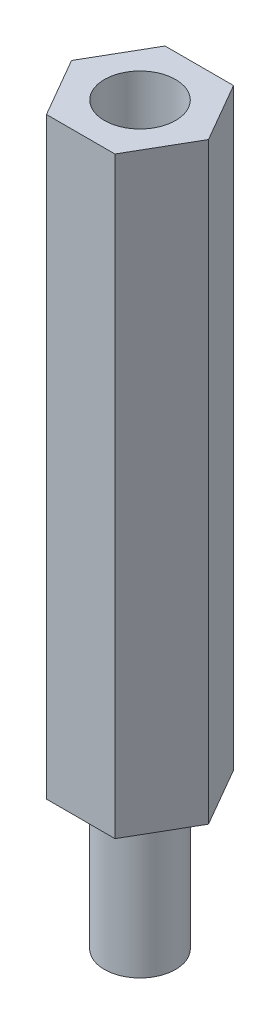
ISO-10303-21;
HEADER;
FILE_DESCRIPTION(('STEP AP214'),'2;1');
FILE_NAME('part.step','',(''),(''),'','','');
FILE_SCHEMA(('AUTOMOTIVE_DESIGN { 1 0 10303 214 1 1 1 1 }'));
ENDSEC;
DATA;
#1=APPLICATION_CONTEXT('core data for automotive mechanical design processes');
#2=APPLICATION_PROTOCOL_DEFINITION('international standard','automotive_design',2000,#1);
#3=PRODUCT_CONTEXT('',#1,'mechanical');
#4=PRODUCT('Part','Part','',(#3));
#5=PRODUCT_RELATED_PRODUCT_CATEGORY('part','',(#4));
#6=PRODUCT_DEFINITION_FORMATION('','',#4);
#7=PRODUCT_DEFINITION_CONTEXT('part definition',#1,'design');
#8=PRODUCT_DEFINITION('design','',#6,#7);
#9=PRODUCT_DEFINITION_SHAPE('','',#8);
#10=(LENGTH_UNIT() NAMED_UNIT(*) SI_UNIT(.MILLI.,.METRE.));
#11=(NAMED_UNIT(*) PLANE_ANGLE_UNIT() SI_UNIT($,.RADIAN.));
#12=(NAMED_UNIT(*) SI_UNIT($,.STERADIAN.) SOLID_ANGLE_UNIT());
#13=UNCERTAINTY_MEASURE_WITH_UNIT(LENGTH_MEASURE(1.E-05),#10,'distance_accuracy_value','');
#14=(GEOMETRIC_REPRESENTATION_CONTEXT(3) GLOBAL_UNCERTAINTY_ASSIGNED_CONTEXT((#13)) GLOBAL_UNIT_ASSIGNED_CONTEXT((#10,
#11,#12)) REPRESENTATION_CONTEXT('',''));
#15=CARTESIAN_POINT('',(0.,0.,0.));
#16=DIRECTION('',(0.,0.,1.));
#17=DIRECTION('',(1.,0.,0.));
#18=AXIS2_PLACEMENT_3D('',#15,#16,#17);
#19=CARTESIAN_POINT('',(0.,19.,0.));
#20=DIRECTION('',(0.,1.,0.));
#21=DIRECTION('',(0.,0.,1.));
#22=AXIS2_PLACEMENT_3D('',#19,#20,#21);
#23=PLANE('',#22);
#24=CARTESIAN_POINT('',(0.,19.,0.));
#25=DIRECTION('',(0.,1.,0.));
#26=DIRECTION('',(0.,0.,1.));
#27=AXIS2_PLACEMENT_3D('',#24,#25,#26);
#28=CIRCLE('',#27,1.5);
#29=CARTESIAN_POINT('',(0.,19.,1.5));
#30=VERTEX_POINT('',#29);
#31=EDGE_CURVE('E19',#30,#30,#28,.T.);
#32=ORIENTED_EDGE('',*,*,#31,.T.);
#33=EDGE_LOOP('',(#32));
#34=FACE_BOUND('',#33,.T.);
#35=ADVANCED_FACE('F16',(#34),#23,.T.);
#36=CARTESIAN_POINT('',(0.,-6.,0.));
#37=DIRECTION('',(0.,-1.,0.));
#38=DIRECTION('',(0.,0.,-1.));
#39=AXIS2_PLACEMENT_3D('',#36,#37,#38);
#40=PLANE('',#39);
#41=CARTESIAN_POINT('',(0.,-6.,0.));
#42=DIRECTION('',(0.,1.,0.));
#43=DIRECTION('',(0.,0.,1.));
#44=AXIS2_PLACEMENT_3D('',#41,#42,#43);
#45=CIRCLE('',#44,1.5);
#46=CARTESIAN_POINT('',(0.,-6.,1.5));
#47=VERTEX_POINT('',#46);
#48=EDGE_CURVE('E81',#47,#47,#45,.T.);
#49=ORIENTED_EDGE('',*,*,#48,.F.);
#50=EDGE_LOOP('',(#49));
#51=FACE_BOUND('',#50,.T.);
#52=ADVANCED_FACE('F113',(#51),#40,.T.);
#53=CARTESIAN_POINT('',(0.,19.,0.));
#54=DIRECTION('',(0.,1.,0.));
#55=DIRECTION('',(0.,0.,1.));
#56=AXIS2_PLACEMENT_3D('',#53,#54,#55);
#57=CYLINDRICAL_SURFACE('',#56,1.5);
#58=CARTESIAN_POINT('',(0.,25.,0.));
#59=DIRECTION('',(0.,1.,0.));
#60=DIRECTION('',(0.,0.,1.));
#61=AXIS2_PLACEMENT_3D('',#58,#59,#60);
#62=CIRCLE('',#61,1.5);
#63=CARTESIAN_POINT('',(0.,25.,1.5));
#64=VERTEX_POINT('',#63);
#65=EDGE_CURVE('E90',#64,#64,#62,.F.);
#66=ORIENTED_EDGE('',*,*,#65,.F.);
#67=EDGE_LOOP('',(#66));
#68=FACE_BOUND('',#67,.T.);
#69=ORIENTED_EDGE('',*,*,#31,.F.);
#70=EDGE_LOOP('',(#69));
#71=FACE_BOUND('',#70,.T.);
#72=ADVANCED_FACE('F115',(#68,#71),#57,.F.);
#73=CARTESIAN_POINT('',(2.88675134594813,25.,0.));
#74=DIRECTION('',(-0.866025403784439,0.,0.5));
#75=DIRECTION('',(0.5,0.,0.866025403784439));
#76=AXIS2_PLACEMENT_3D('',#73,#74,#75);
#77=PLANE('',#76);
#78=DIRECTION('',(0.,1.,0.));
#79=VECTOR('',#78,1.);
#80=CARTESIAN_POINT('',(1.44337567297406,25.,-2.50000000000002));
#81=LINE('',#80,#79);
#82=CARTESIAN_POINT('',(1.44337567297406,0.,-2.50000000000002));
#83=VERTEX_POINT('',#82);
#84=CARTESIAN_POINT('',(1.44337567297406,25.,-2.50000000000002));
#85=VERTEX_POINT('',#84);
#86=EDGE_CURVE('E93',#83,#85,#81,.T.);
#87=ORIENTED_EDGE('',*,*,#86,.T.);
#88=DIRECTION('',(-0.5,0.,-0.866025403784439));
#89=VECTOR('',#88,1.);
#90=CARTESIAN_POINT('',(2.88675134594813,25.,0.));
#91=LINE('',#90,#89);
#92=CARTESIAN_POINT('',(2.88675134594813,25.,0.));
#93=VERTEX_POINT('',#92);
#94=EDGE_CURVE('E87',#93,#85,#91,.T.);
#95=ORIENTED_EDGE('',*,*,#94,.F.);
#96=DIRECTION('',(0.,1.,0.));
#97=VECTOR('',#96,1.);
#98=CARTESIAN_POINT('',(2.88675134594813,25.,0.));
#99=LINE('',#98,#97);
#100=CARTESIAN_POINT('',(2.88675134594813,0.,0.));
#101=VERTEX_POINT('',#100);
#102=EDGE_CURVE('E72',#93,#101,#99,.F.);
#103=ORIENTED_EDGE('',*,*,#102,.T.);
#104=DIRECTION('',(-0.5,0.,-0.866025403784439));
#105=VECTOR('',#104,1.);
#106=CARTESIAN_POINT('',(2.88675134594813,0.,0.));
#107=LINE('',#106,#105);
#108=EDGE_CURVE('E250',#101,#83,#107,.T.);
#109=ORIENTED_EDGE('',*,*,#108,.T.);
#110=EDGE_LOOP('',(#87,#95,#103,#109));
#111=FACE_BOUND('',#110,.T.);
#112=ADVANCED_FACE('F92',(#111),#77,.F.);
#113=CARTESIAN_POINT('',(-1.44337567297409,25.,2.50000000000002));
#114=DIRECTION('',(0.,0.,-1.));
#115=DIRECTION('',(-1.,0.,0.));
#116=AXIS2_PLACEMENT_3D('',#113,#114,#115);
#117=PLANE('',#116);
#118=DIRECTION('',(0.,1.,0.));
#119=VECTOR('',#118,1.);
#120=CARTESIAN_POINT('',(1.44337567297406,25.,2.50000000000002));
#121=LINE('',#120,#119);
#122=CARTESIAN_POINT('',(1.44337567297406,0.,2.50000000000002));
#123=VERTEX_POINT('',#122);
#124=CARTESIAN_POINT('',(1.44337567297406,25.,2.50000000000002));
#125=VERTEX_POINT('',#124);
#126=EDGE_CURVE('E65',#123,#125,#121,.T.);
#127=ORIENTED_EDGE('',*,*,#126,.T.);
#128=DIRECTION('',(1.,0.,0.));
#129=VECTOR('',#128,1.);
#130=CARTESIAN_POINT('',(0.,25.,2.50000000000002));
#131=LINE('',#130,#129);
#132=CARTESIAN_POINT('',(-1.44337567297409,25.,2.50000000000002));
#133=VERTEX_POINT('',#132);
#134=EDGE_CURVE('E89',#133,#125,#131,.T.);
#135=ORIENTED_EDGE('',*,*,#134,.F.);
#136=DIRECTION('',(0.,1.,0.));
#137=VECTOR('',#136,1.);
#138=CARTESIAN_POINT('',(-1.44337567297409,25.,2.50000000000002));
#139=LINE('',#138,#137);
#140=CARTESIAN_POINT('',(-1.44337567297409,0.,2.50000000000002));
#141=VERTEX_POINT('',#140);
#142=EDGE_CURVE('E252',#133,#141,#139,.F.);
#143=ORIENTED_EDGE('',*,*,#142,.T.);
#144=DIRECTION('',(1.,0.,0.));
#145=VECTOR('',#144,1.);
#146=CARTESIAN_POINT('',(0.,0.,2.50000000000002));
#147=LINE('',#146,#145);
#148=EDGE_CURVE('E246',#141,#123,#147,.T.);
#149=ORIENTED_EDGE('',*,*,#148,.T.);
#150=EDGE_LOOP('',(#127,#135,#143,#149));
#151=FACE_BOUND('',#150,.T.);
#152=ADVANCED_FACE('F150',(#151),#117,.F.);
#153=CARTESIAN_POINT('',(1.44337567297406,25.,2.50000000000002));
#154=DIRECTION('',(-0.866025403784439,0.,-0.499999999999999));
#155=DIRECTION('',(-0.499999999999999,0.,0.866025403784439));
#156=AXIS2_PLACEMENT_3D('',#153,#154,#155);
#157=PLANE('',#156);
#158=ORIENTED_EDGE('',*,*,#102,.F.);
#159=DIRECTION('',(0.499999999999999,0.,-0.866025403784439));
#160=VECTOR('',#159,1.);
#161=CARTESIAN_POINT('',(1.44337567297406,25.,2.50000000000002));
#162=LINE('',#161,#160);
#163=EDGE_CURVE('E75',#125,#93,#162,.T.);
#164=ORIENTED_EDGE('',*,*,#163,.F.);
#165=ORIENTED_EDGE('',*,*,#126,.F.);
#166=DIRECTION('',(0.499999999999999,0.,-0.866025403784439));
#167=VECTOR('',#166,1.);
#168=CARTESIAN_POINT('',(1.44337567297406,0.,2.50000000000002));
#169=LINE('',#168,#167);
#170=EDGE_CURVE('E77',#123,#101,#169,.T.);
#171=ORIENTED_EDGE('',*,*,#170,.T.);
#172=EDGE_LOOP('',(#158,#164,#165,#171));
#173=FACE_BOUND('',#172,.T.);
#174=ADVANCED_FACE('F74',(#173),#157,.F.);
#175=CARTESIAN_POINT('',(0.,-6.,0.));
#176=DIRECTION('',(0.,1.,0.));
#177=DIRECTION('',(0.,0.,1.));
#178=AXIS2_PLACEMENT_3D('',#175,#176,#177);
#179=CYLINDRICAL_SURFACE('',#178,1.5);
#180=ORIENTED_EDGE('',*,*,#48,.T.);
#181=EDGE_LOOP('',(#180));
#182=FACE_BOUND('',#181,.T.);
#183=CARTESIAN_POINT('',(0.,0.,0.));
#184=DIRECTION('',(0.,1.,0.));
#185=DIRECTION('',(0.,0.,1.));
#186=AXIS2_PLACEMENT_3D('',#183,#184,#185);
#187=CIRCLE('',#186,1.5);
#188=CARTESIAN_POINT('',(0.,0.,1.5));
#189=VERTEX_POINT('',#188);
#190=EDGE_CURVE('E102',#189,#189,#187,.F.);
#191=ORIENTED_EDGE('',*,*,#190,.T.);
#192=EDGE_LOOP('',(#191));
#193=FACE_BOUND('',#192,.T.);
#194=ADVANCED_FACE('F110',(#182,#193),#179,.T.);
#195=CARTESIAN_POINT('',(1.44337567297406,25.,-2.50000000000002));
#196=DIRECTION('',(0.,0.,1.));
#197=DIRECTION('',(1.,0.,0.));
#198=AXIS2_PLACEMENT_3D('',#195,#196,#197);
#199=PLANE('',#198);
#200=DIRECTION('',(0.,1.,0.));
#201=VECTOR('',#200,1.);
#202=CARTESIAN_POINT('',(-1.44337567297406,25.,-2.50000000000002));
#203=LINE('',#202,#201);
#204=CARTESIAN_POINT('',(-1.44337567297406,0.,-2.50000000000002));
#205=VERTEX_POINT('',#204);
#206=CARTESIAN_POINT('',(-1.44337567297406,25.,-2.50000000000002));
#207=VERTEX_POINT('',#206);
#208=EDGE_CURVE('E105',#205,#207,#203,.T.);
#209=ORIENTED_EDGE('',*,*,#208,.T.);
#210=DIRECTION('',(1.,0.,0.));
#211=VECTOR('',#210,1.);
#212=CARTESIAN_POINT('',(0.,25.,-2.50000000000002));
#213=LINE('',#212,#211);
#214=EDGE_CURVE('E95',#85,#207,#213,.F.);
#215=ORIENTED_EDGE('',*,*,#214,.F.);
#216=ORIENTED_EDGE('',*,*,#86,.F.);
#217=DIRECTION('',(1.,0.,0.));
#218=VECTOR('',#217,1.);
#219=CARTESIAN_POINT('',(0.,0.,-2.50000000000002));
#220=LINE('',#219,#218);
#221=EDGE_CURVE('E237',#83,#205,#220,.F.);
#222=ORIENTED_EDGE('',*,*,#221,.T.);
#223=EDGE_LOOP('',(#209,#215,#216,#222));
#224=FACE_BOUND('',#223,.T.);
#225=ADVANCED_FACE('F142',(#224),#199,.F.);
#226=CARTESIAN_POINT('',(0.,25.,0.));
#227=DIRECTION('',(0.,1.,0.));
#228=DIRECTION('',(0.,0.,1.));
#229=AXIS2_PLACEMENT_3D('',#226,#227,#228);
#230=PLANE('',#229);
#231=DIRECTION('',(-0.5,0.,-0.866025403784439));
#232=VECTOR('',#231,1.);
#233=CARTESIAN_POINT('',(-2.88675134594815,25.,0.));
#234=LINE('',#233,#232);
#235=CARTESIAN_POINT('',(-2.88675134594815,25.,0.));
#236=VERTEX_POINT('',#235);
#237=EDGE_CURVE('E254',#236,#133,#234,.F.);
#238=ORIENTED_EDGE('',*,*,#237,.T.);
#239=ORIENTED_EDGE('',*,*,#134,.T.);
#240=ORIENTED_EDGE('',*,*,#163,.T.);
#241=ORIENTED_EDGE('',*,*,#94,.T.);
#242=ORIENTED_EDGE('',*,*,#214,.T.);
#243=DIRECTION('',(0.5,0.,-0.866025403784439));
#244=VECTOR('',#243,1.);
#245=CARTESIAN_POINT('',(-1.44337567297406,25.,-2.50000000000002));
#246=LINE('',#245,#244);
#247=EDGE_CURVE('E239',#207,#236,#246,.F.);
#248=ORIENTED_EDGE('',*,*,#247,.T.);
#249=EDGE_LOOP('',(#238,#239,#240,#241,#242,#248));
#250=FACE_BOUND('',#249,.T.);
#251=ORIENTED_EDGE('',*,*,#65,.T.);
#252=EDGE_LOOP('',(#251));
#253=FACE_BOUND('',#252,.T.);
#254=ADVANCED_FACE('F85',(#250,#253),#230,.T.);
#255=CARTESIAN_POINT('',(-2.88675134594815,25.,0.));
#256=DIRECTION('',(0.866025403784439,0.,-0.5));
#257=DIRECTION('',(-0.5,0.,-0.866025403784439));
#258=AXIS2_PLACEMENT_3D('',#255,#256,#257);
#259=PLANE('',#258);
#260=ORIENTED_EDGE('',*,*,#142,.F.);
#261=ORIENTED_EDGE('',*,*,#237,.F.);
#262=DIRECTION('',(0.,1.,0.));
#263=VECTOR('',#262,1.);
#264=CARTESIAN_POINT('',(-2.88675134594815,25.,0.));
#265=LINE('',#264,#263);
#266=CARTESIAN_POINT('',(-2.88675134594815,0.,0.));
#267=VERTEX_POINT('',#266);
#268=EDGE_CURVE('E25',#236,#267,#265,.F.);
#269=ORIENTED_EDGE('',*,*,#268,.T.);
#270=DIRECTION('',(0.5,0.,0.866025403784439));
#271=VECTOR('',#270,1.);
#272=CARTESIAN_POINT('',(-2.88675134594815,0.,0.));
#273=LINE('',#272,#271);
#274=EDGE_CURVE('E33',#267,#141,#273,.T.);
#275=ORIENTED_EDGE('',*,*,#274,.T.);
#276=EDGE_LOOP('',(#260,#261,#269,#275));
#277=FACE_BOUND('',#276,.T.);
#278=ADVANCED_FACE('F132',(#277),#259,.F.);
#279=CARTESIAN_POINT('',(0.,0.,0.));
#280=DIRECTION('',(0.,1.,0.));
#281=DIRECTION('',(0.,0.,1.));
#282=AXIS2_PLACEMENT_3D('',#279,#280,#281);
#283=PLANE('',#282);
#284=ORIENTED_EDGE('',*,*,#190,.F.);
#285=EDGE_LOOP('',(#284));
#286=FACE_BOUND('',#285,.T.);
#287=ORIENTED_EDGE('',*,*,#148,.F.);
#288=ORIENTED_EDGE('',*,*,#274,.F.);
#289=DIRECTION('',(0.5,0.,-0.866025403784439));
#290=VECTOR('',#289,1.);
#291=CARTESIAN_POINT('',(-1.44337567297406,0.,-2.50000000000002));
#292=LINE('',#291,#290);
#293=EDGE_CURVE('E11',#267,#205,#292,.T.);
#294=ORIENTED_EDGE('',*,*,#293,.T.);
#295=ORIENTED_EDGE('',*,*,#221,.F.);
#296=ORIENTED_EDGE('',*,*,#108,.F.);
#297=ORIENTED_EDGE('',*,*,#170,.F.);
#298=EDGE_LOOP('',(#287,#288,#294,#295,#296,#297));
#299=FACE_BOUND('',#298,.T.);
#300=ADVANCED_FACE('F126',(#286,#299),#283,.F.);
#301=CARTESIAN_POINT('',(-1.44337567297406,25.,-2.50000000000002));
#302=DIRECTION('',(0.866025403784439,0.,0.5));
#303=DIRECTION('',(0.5,0.,-0.866025403784439));
#304=AXIS2_PLACEMENT_3D('',#301,#302,#303);
#305=PLANE('',#304);
#306=ORIENTED_EDGE('',*,*,#268,.F.);
#307=ORIENTED_EDGE('',*,*,#247,.F.);
#308=ORIENTED_EDGE('',*,*,#208,.F.);
#309=ORIENTED_EDGE('',*,*,#293,.F.);
#310=EDGE_LOOP('',(#306,#307,#308,#309));
#311=FACE_BOUND('',#310,.T.);
#312=ADVANCED_FACE('F124',(#311),#305,.F.);
#313=CLOSED_SHELL('',(#35,#52,#72,#112,#152,#174,#194,#225,#254,#278,#300,#312));
#314=MANIFOLD_SOLID_BREP('B1',#313);
#315=ADVANCED_BREP_SHAPE_REPRESENTATION('',(#18,#314),#14);
#316=SHAPE_DEFINITION_REPRESENTATION(#9,#315);
ENDSEC;
END-ISO-10303-21;
